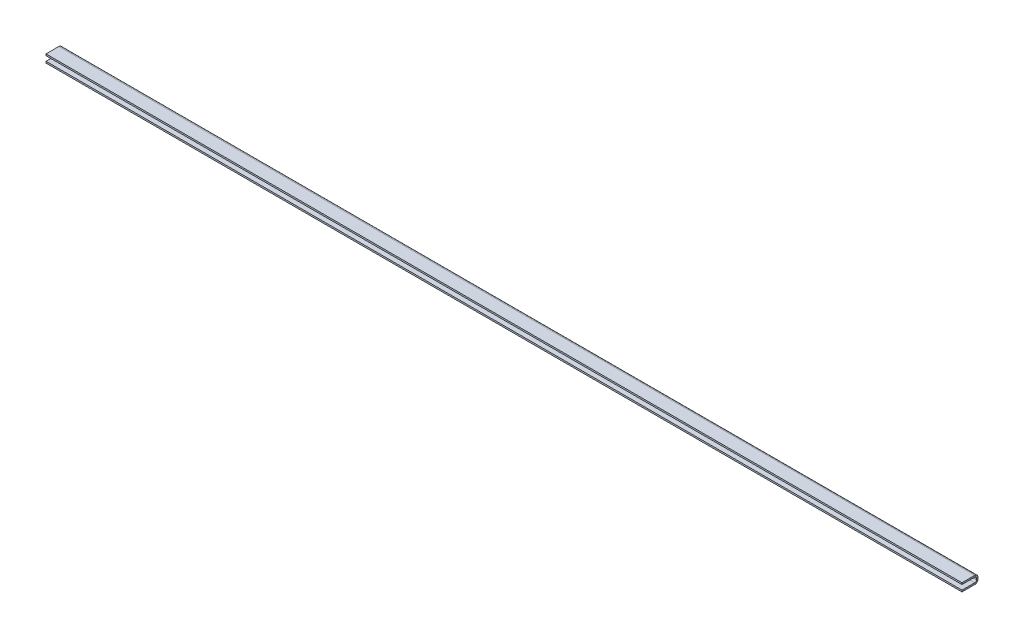
ISO-10303-21;
HEADER;
FILE_DESCRIPTION(('STEP AP214'),'2;1');
FILE_NAME('part.step','',(''),(''),'','','');
FILE_SCHEMA(('AUTOMOTIVE_DESIGN { 1 0 10303 214 1 1 1 1 }'));
ENDSEC;
DATA;
#1=APPLICATION_CONTEXT('core data for automotive mechanical design processes');
#2=APPLICATION_PROTOCOL_DEFINITION('international standard','automotive_design',2000,#1);
#3=PRODUCT_CONTEXT('',#1,'mechanical');
#4=PRODUCT('Part','Part','',(#3));
#5=PRODUCT_RELATED_PRODUCT_CATEGORY('part','',(#4));
#6=PRODUCT_DEFINITION_FORMATION('','',#4);
#7=PRODUCT_DEFINITION_CONTEXT('part definition',#1,'design');
#8=PRODUCT_DEFINITION('design','',#6,#7);
#9=PRODUCT_DEFINITION_SHAPE('','',#8);
#10=(LENGTH_UNIT() NAMED_UNIT(*) SI_UNIT(.MILLI.,.METRE.));
#11=(NAMED_UNIT(*) PLANE_ANGLE_UNIT() SI_UNIT($,.RADIAN.));
#12=(NAMED_UNIT(*) SI_UNIT($,.STERADIAN.) SOLID_ANGLE_UNIT());
#13=UNCERTAINTY_MEASURE_WITH_UNIT(LENGTH_MEASURE(1.E-05),#10,'distance_accuracy_value','');
#14=(GEOMETRIC_REPRESENTATION_CONTEXT(3) GLOBAL_UNCERTAINTY_ASSIGNED_CONTEXT((#13)) GLOBAL_UNIT_ASSIGNED_CONTEXT((#10,
#11,#12)) REPRESENTATION_CONTEXT('',''));
#15=CARTESIAN_POINT('',(0.,0.,0.));
#16=DIRECTION('',(0.,0.,1.));
#17=DIRECTION('',(1.,0.,0.));
#18=AXIS2_PLACEMENT_3D('',#15,#16,#17);
#19=CARTESIAN_POINT('',(0.,0.,-2.));
#20=DIRECTION('',(0.,0.,1.));
#21=DIRECTION('',(1.,0.,0.));
#22=AXIS2_PLACEMENT_3D('',#19,#20,#21);
#23=PLANE('',#22);
#24=DIRECTION('',(1.,0.,0.));
#25=VECTOR('',#24,1.);
#26=CARTESIAN_POINT('',(572.,-1.,-1.99999999999996));
#27=LINE('',#26,#25);
#28=CARTESIAN_POINT('',(572.,-1.,-1.99999999999996));
#29=VERTEX_POINT('',#28);
#30=CARTESIAN_POINT('',(-572.,-0.99999999999999,-2.));
#31=VERTEX_POINT('',#30);
#32=EDGE_CURVE('E211',#29,#31,#27,.F.);
#33=ORIENTED_EDGE('',*,*,#32,.T.);
#34=DIRECTION('',(0.,-1.,0.));
#35=VECTOR('',#34,1.);
#36=CARTESIAN_POINT('',(-572.,5.,-2.));
#37=LINE('',#36,#35);
#38=CARTESIAN_POINT('',(-572.,1.00000000000001,-2.));
#39=VERTEX_POINT('',#38);
#40=EDGE_CURVE('E13',#39,#31,#37,.T.);
#41=ORIENTED_EDGE('',*,*,#40,.F.);
#42=DIRECTION('',(-1.,0.,0.));
#43=VECTOR('',#42,1.);
#44=CARTESIAN_POINT('',(-572.,1.00000000000001,-2.));
#45=LINE('',#44,#43);
#46=CARTESIAN_POINT('',(572.,1.00000000000002,-2.));
#47=VERTEX_POINT('',#46);
#48=EDGE_CURVE('E264',#39,#47,#45,.F.);
#49=ORIENTED_EDGE('',*,*,#48,.T.);
#50=DIRECTION('',(0.,1.,0.));
#51=VECTOR('',#50,1.);
#52=CARTESIAN_POINT('',(572.,5.,-2.));
#53=LINE('',#52,#51);
#54=EDGE_CURVE('E87',#29,#47,#53,.T.);
#55=ORIENTED_EDGE('',*,*,#54,.F.);
#56=EDGE_LOOP('',(#33,#41,#49,#55));
#57=FACE_BOUND('',#56,.T.);
#58=ADVANCED_FACE('F78',(#57),#23,.F.);
#59=CARTESIAN_POINT('',(0.,0.,0.));
#60=DIRECTION('',(0.,0.,1.));
#61=DIRECTION('',(1.,0.,0.));
#62=AXIS2_PLACEMENT_3D('',#59,#60,#61);
#63=PLANE('',#62);
#64=DIRECTION('',(0.,-1.,0.));
#65=VECTOR('',#64,1.);
#66=CARTESIAN_POINT('',(-572.,5.,0.));
#67=LINE('',#66,#65);
#68=CARTESIAN_POINT('',(-572.,1.00000000000001,0.));
#69=VERTEX_POINT('',#68);
#70=CARTESIAN_POINT('',(-572.,-1.,0.));
#71=VERTEX_POINT('',#70);
#72=EDGE_CURVE('E82',#69,#71,#67,.T.);
#73=ORIENTED_EDGE('',*,*,#72,.T.);
#74=DIRECTION('',(1.,0.,0.));
#75=VECTOR('',#74,1.);
#76=CARTESIAN_POINT('',(572.,-1.,0.));
#77=LINE('',#76,#75);
#78=CARTESIAN_POINT('',(572.,-1.,0.));
#79=VERTEX_POINT('',#78);
#80=EDGE_CURVE('E223',#79,#71,#77,.F.);
#81=ORIENTED_EDGE('',*,*,#80,.F.);
#82=DIRECTION('',(0.,1.,0.));
#83=VECTOR('',#82,1.);
#84=CARTESIAN_POINT('',(572.,5.,0.));
#85=LINE('',#84,#83);
#86=CARTESIAN_POINT('',(572.,1.00000000000001,0.));
#87=VERTEX_POINT('',#86);
#88=EDGE_CURVE('E282',#79,#87,#85,.T.);
#89=ORIENTED_EDGE('',*,*,#88,.T.);
#90=DIRECTION('',(-1.,0.,0.));
#91=VECTOR('',#90,1.);
#92=CARTESIAN_POINT('',(-572.,1.00000000000001,0.));
#93=LINE('',#92,#91);
#94=EDGE_CURVE('E95',#69,#87,#93,.F.);
#95=ORIENTED_EDGE('',*,*,#94,.F.);
#96=EDGE_LOOP('',(#73,#81,#89,#95));
#97=FACE_BOUND('',#96,.T.);
#98=ADVANCED_FACE('F286',(#97),#63,.T.);
#99=CARTESIAN_POINT('',(572.,5.,-2.));
#100=DIRECTION('',(1.,0.,0.));
#101=DIRECTION('',(0.,0.,-1.));
#102=AXIS2_PLACEMENT_3D('',#99,#100,#101);
#103=PLANE('',#102);
#104=ORIENTED_EDGE('',*,*,#88,.F.);
#105=DIRECTION('',(0.,0.,-1.));
#106=VECTOR('',#105,1.);
#107=CARTESIAN_POINT('',(572.,-1.,0.));
#108=LINE('',#107,#106);
#109=EDGE_CURVE('E217',#79,#29,#108,.T.);
#110=ORIENTED_EDGE('',*,*,#109,.T.);
#111=ORIENTED_EDGE('',*,*,#54,.T.);
#112=DIRECTION('',(0.,0.,-1.));
#113=VECTOR('',#112,1.);
#114=CARTESIAN_POINT('',(572.,1.00000000000001,0.));
#115=LINE('',#114,#113);
#116=EDGE_CURVE('E279',#87,#47,#115,.T.);
#117=ORIENTED_EDGE('',*,*,#116,.F.);
#118=EDGE_LOOP('',(#104,#110,#111,#117));
#119=FACE_BOUND('',#118,.T.);
#120=ADVANCED_FACE('F80',(#119),#103,.T.);
#121=CARTESIAN_POINT('',(-572.,5.,-2.));
#122=DIRECTION('',(-1.,0.,0.));
#123=DIRECTION('',(0.,0.,1.));
#124=AXIS2_PLACEMENT_3D('',#121,#122,#123);
#125=PLANE('',#124);
#126=DIRECTION('',(0.,0.,-1.));
#127=VECTOR('',#126,1.);
#128=CARTESIAN_POINT('',(-572.,-1.,0.));
#129=LINE('',#128,#127);
#130=EDGE_CURVE('E229',#71,#31,#129,.T.);
#131=ORIENTED_EDGE('',*,*,#130,.F.);
#132=ORIENTED_EDGE('',*,*,#72,.F.);
#133=DIRECTION('',(0.,0.,-1.));
#134=VECTOR('',#133,1.);
#135=CARTESIAN_POINT('',(-572.,1.00000000000001,0.));
#136=LINE('',#135,#134);
#137=EDGE_CURVE('E270',#69,#39,#136,.T.);
#138=ORIENTED_EDGE('',*,*,#137,.T.);
#139=ORIENTED_EDGE('',*,*,#40,.T.);
#140=EDGE_LOOP('',(#131,#132,#138,#139));
#141=FACE_BOUND('',#140,.T.);
#142=ADVANCED_FACE('F358',(#141),#125,.T.);
#143=CARTESIAN_POINT('',(572.,1.00000000000001,2.));
#144=DIRECTION('',(1.,0.,0.));
#145=DIRECTION('',(0.,0.,-1.));
#146=AXIS2_PLACEMENT_3D('',#143,#144,#145);
#147=PLANE('',#146);
#148=DIRECTION('',(0.,-1.,0.));
#149=VECTOR('',#148,1.);
#150=CARTESIAN_POINT('',(572.,5.00000000000001,1.99999999999999));
#151=LINE('',#150,#149);
#152=CARTESIAN_POINT('',(572.,3.00000000000001,1.99999999999999));
#153=VERTEX_POINT('',#152);
#154=CARTESIAN_POINT('',(572.,5.00000000000001,1.99999999999999));
#155=VERTEX_POINT('',#154);
#156=EDGE_CURVE('E232',#153,#155,#151,.F.);
#157=ORIENTED_EDGE('',*,*,#156,.F.);
#158=CARTESIAN_POINT('',(572.,1.00000000000001,2.));
#159=DIRECTION('',(-1.,0.,0.));
#160=DIRECTION('',(0.,0.,1.));
#161=AXIS2_PLACEMENT_3D('',#158,#159,#160);
#162=CIRCLE('',#161,2.);
#163=EDGE_CURVE('E273',#87,#153,#162,.F.);
#164=ORIENTED_EDGE('',*,*,#163,.F.);
#165=ORIENTED_EDGE('',*,*,#116,.T.);
#166=CARTESIAN_POINT('',(572.,1.00000000000001,2.));
#167=DIRECTION('',(-1.,0.,0.));
#168=DIRECTION('',(0.,0.,1.));
#169=AXIS2_PLACEMENT_3D('',#166,#167,#168);
#170=CIRCLE('',#169,4.);
#171=EDGE_CURVE('E266',#47,#155,#170,.F.);
#172=ORIENTED_EDGE('',*,*,#171,.T.);
#173=EDGE_LOOP('',(#157,#164,#165,#172));
#174=FACE_BOUND('',#173,.T.);
#175=ADVANCED_FACE('F317',(#174),#147,.T.);
#176=CARTESIAN_POINT('',(-572.,1.00000000000001,2.));
#177=DIRECTION('',(1.,0.,0.));
#178=DIRECTION('',(0.,0.,-1.));
#179=AXIS2_PLACEMENT_3D('',#176,#177,#178);
#180=PLANE('',#179);
#181=CARTESIAN_POINT('',(-572.,1.00000000000001,2.));
#182=DIRECTION('',(-1.,0.,0.));
#183=DIRECTION('',(0.,0.,1.));
#184=AXIS2_PLACEMENT_3D('',#181,#182,#183);
#185=CIRCLE('',#184,2.);
#186=CARTESIAN_POINT('',(-572.,3.00000000000001,1.99999999999999));
#187=VERTEX_POINT('',#186);
#188=EDGE_CURVE('E237',#187,#69,#185,.T.);
#189=ORIENTED_EDGE('',*,*,#188,.F.);
#190=DIRECTION('',(0.,-1.,0.));
#191=VECTOR('',#190,1.);
#192=CARTESIAN_POINT('',(-572.,3.00000000000001,1.99999999999999));
#193=LINE('',#192,#191);
#194=CARTESIAN_POINT('',(-572.,5.00000000000001,1.99999999999999));
#195=VERTEX_POINT('',#194);
#196=EDGE_CURVE('E257',#187,#195,#193,.F.);
#197=ORIENTED_EDGE('',*,*,#196,.T.);
#198=CARTESIAN_POINT('',(-572.,1.00000000000001,2.));
#199=DIRECTION('',(-1.,0.,0.));
#200=DIRECTION('',(0.,0.,1.));
#201=AXIS2_PLACEMENT_3D('',#198,#199,#200);
#202=CIRCLE('',#201,4.);
#203=EDGE_CURVE('E267',#195,#39,#202,.T.);
#204=ORIENTED_EDGE('',*,*,#203,.T.);
#205=ORIENTED_EDGE('',*,*,#137,.F.);
#206=EDGE_LOOP('',(#189,#197,#204,#205));
#207=FACE_BOUND('',#206,.T.);
#208=ADVANCED_FACE('F337',(#207),#180,.F.);
#209=CARTESIAN_POINT('',(-572.,1.00000000000001,2.));
#210=DIRECTION('',(-1.,0.,0.));
#211=DIRECTION('',(0.,1.,0.));
#212=AXIS2_PLACEMENT_3D('',#209,#210,#211);
#213=CYLINDRICAL_SURFACE('',#212,4.);
#214=ORIENTED_EDGE('',*,*,#48,.F.);
#215=ORIENTED_EDGE('',*,*,#203,.F.);
#216=DIRECTION('',(-1.,0.,0.));
#217=VECTOR('',#216,1.);
#218=CARTESIAN_POINT('',(572.,5.00000000000001,1.99999999999999));
#219=LINE('',#218,#217);
#220=EDGE_CURVE('E255',#195,#155,#219,.F.);
#221=ORIENTED_EDGE('',*,*,#220,.T.);
#222=ORIENTED_EDGE('',*,*,#171,.F.);
#223=EDGE_LOOP('',(#214,#215,#221,#222));
#224=FACE_BOUND('',#223,.T.);
#225=ADVANCED_FACE('F366',(#224),#213,.T.);
#226=CARTESIAN_POINT('',(-572.,1.00000000000001,2.));
#227=DIRECTION('',(-1.,0.,0.));
#228=DIRECTION('',(0.,1.,0.));
#229=AXIS2_PLACEMENT_3D('',#226,#227,#228);
#230=CYLINDRICAL_SURFACE('',#229,2.);
#231=ORIENTED_EDGE('',*,*,#94,.T.);
#232=ORIENTED_EDGE('',*,*,#163,.T.);
#233=DIRECTION('',(-1.,0.,0.));
#234=VECTOR('',#233,1.);
#235=CARTESIAN_POINT('',(572.,3.00000000000001,1.99999999999999));
#236=LINE('',#235,#234);
#237=EDGE_CURVE('E260',#153,#187,#236,.T.);
#238=ORIENTED_EDGE('',*,*,#237,.T.);
#239=ORIENTED_EDGE('',*,*,#188,.T.);
#240=EDGE_LOOP('',(#231,#232,#238,#239));
#241=FACE_BOUND('',#240,.T.);
#242=ADVANCED_FACE('F314',(#241),#230,.F.);
#243=CARTESIAN_POINT('',(572.,5.,0.));
#244=DIRECTION('',(-1.,0.,0.));
#245=DIRECTION('',(0.,0.,1.));
#246=AXIS2_PLACEMENT_3D('',#243,#244,#245);
#247=PLANE('',#246);
#248=ORIENTED_EDGE('',*,*,#156,.T.);
#249=DIRECTION('',(0.,0.,-1.));
#250=VECTOR('',#249,1.);
#251=CARTESIAN_POINT('',(572.,5.,2.11439221387489E-11));
#252=LINE('',#251,#250);
#253=CARTESIAN_POINT('',(572.,5.00000000000006,18.));
#254=VERTEX_POINT('',#253);
#255=EDGE_CURVE('E245',#254,#155,#252,.T.);
#256=ORIENTED_EDGE('',*,*,#255,.F.);
#257=DIRECTION('',(0.,-1.,0.));
#258=VECTOR('',#257,1.);
#259=CARTESIAN_POINT('',(572.,5.00000000000006,18.));
#260=LINE('',#259,#258);
#261=CARTESIAN_POINT('',(572.,3.00000000000007,18.));
#262=VERTEX_POINT('',#261);
#263=EDGE_CURVE('E238',#254,#262,#260,.T.);
#264=ORIENTED_EDGE('',*,*,#263,.T.);
#265=DIRECTION('',(0.,0.,1.));
#266=VECTOR('',#265,1.);
#267=CARTESIAN_POINT('',(572.,3.,0.));
#268=LINE('',#267,#266);
#269=EDGE_CURVE('E252',#262,#153,#268,.F.);
#270=ORIENTED_EDGE('',*,*,#269,.T.);
#271=EDGE_LOOP('',(#248,#256,#264,#270));
#272=FACE_BOUND('',#271,.T.);
#273=ADVANCED_FACE('F320',(#272),#247,.F.);
#274=CARTESIAN_POINT('',(-572.,5.00000000000006,18.));
#275=DIRECTION('',(1.,0.,0.));
#276=DIRECTION('',(0.,0.,-1.));
#277=AXIS2_PLACEMENT_3D('',#274,#275,#276);
#278=PLANE('',#277);
#279=ORIENTED_EDGE('',*,*,#196,.F.);
#280=DIRECTION('',(0.,0.,-1.));
#281=VECTOR('',#280,1.);
#282=CARTESIAN_POINT('',(-572.,3.00000000000007,18.));
#283=LINE('',#282,#281);
#284=CARTESIAN_POINT('',(-572.,3.00000000000007,18.));
#285=VERTEX_POINT('',#284);
#286=EDGE_CURVE('E250',#187,#285,#283,.F.);
#287=ORIENTED_EDGE('',*,*,#286,.T.);
#288=DIRECTION('',(0.,-1.,0.));
#289=VECTOR('',#288,1.);
#290=CARTESIAN_POINT('',(-572.,5.00000000000006,18.));
#291=LINE('',#290,#289);
#292=CARTESIAN_POINT('',(-572.,5.00000000000006,18.));
#293=VERTEX_POINT('',#292);
#294=EDGE_CURVE('E234',#293,#285,#291,.T.);
#295=ORIENTED_EDGE('',*,*,#294,.F.);
#296=DIRECTION('',(0.,0.,1.));
#297=VECTOR('',#296,1.);
#298=CARTESIAN_POINT('',(-572.,5.,-1.76645404775927E-11));
#299=LINE('',#298,#297);
#300=EDGE_CURVE('E243',#195,#293,#299,.T.);
#301=ORIENTED_EDGE('',*,*,#300,.F.);
#302=EDGE_LOOP('',(#279,#287,#295,#301));
#303=FACE_BOUND('',#302,.T.);
#304=ADVANCED_FACE('F339',(#303),#278,.F.);
#305=CARTESIAN_POINT('',(0.,5.,0.));
#306=DIRECTION('',(0.,-1.,0.));
#307=DIRECTION('',(0.,0.,-1.));
#308=AXIS2_PLACEMENT_3D('',#305,#306,#307);
#309=PLANE('',#308);
#310=ORIENTED_EDGE('',*,*,#220,.F.);
#311=ORIENTED_EDGE('',*,*,#300,.T.);
#312=DIRECTION('',(1.,0.,0.));
#313=VECTOR('',#312,1.);
#314=CARTESIAN_POINT('',(0.,5.00000000000006,18.));
#315=LINE('',#314,#313);
#316=EDGE_CURVE('E241',#293,#254,#315,.T.);
#317=ORIENTED_EDGE('',*,*,#316,.T.);
#318=ORIENTED_EDGE('',*,*,#255,.T.);
#319=EDGE_LOOP('',(#310,#311,#317,#318));
#320=FACE_BOUND('',#319,.T.);
#321=ADVANCED_FACE('F324',(#320),#309,.F.);
#322=CARTESIAN_POINT('',(0.,3.,0.));
#323=DIRECTION('',(0.,-1.,0.));
#324=DIRECTION('',(0.,0.,-1.));
#325=AXIS2_PLACEMENT_3D('',#322,#323,#324);
#326=PLANE('',#325);
#327=ORIENTED_EDGE('',*,*,#286,.F.);
#328=ORIENTED_EDGE('',*,*,#237,.F.);
#329=ORIENTED_EDGE('',*,*,#269,.F.);
#330=DIRECTION('',(-1.,0.,0.));
#331=VECTOR('',#330,1.);
#332=CARTESIAN_POINT('',(572.,3.00000000000007,18.));
#333=LINE('',#332,#331);
#334=EDGE_CURVE('E248',#285,#262,#333,.F.);
#335=ORIENTED_EDGE('',*,*,#334,.F.);
#336=EDGE_LOOP('',(#327,#328,#329,#335));
#337=FACE_BOUND('',#336,.T.);
#338=ADVANCED_FACE('F334',(#337),#326,.T.);
#339=CARTESIAN_POINT('',(572.,5.00000000000006,18.));
#340=DIRECTION('',(0.,0.,-1.));
#341=DIRECTION('',(0.,1.,0.));
#342=AXIS2_PLACEMENT_3D('',#339,#340,#341);
#343=PLANE('',#342);
#344=ORIENTED_EDGE('',*,*,#334,.T.);
#345=ORIENTED_EDGE('',*,*,#263,.F.);
#346=ORIENTED_EDGE('',*,*,#316,.F.);
#347=ORIENTED_EDGE('',*,*,#294,.T.);
#348=EDGE_LOOP('',(#344,#345,#346,#347));
#349=FACE_BOUND('',#348,.T.);
#350=ADVANCED_FACE('F330',(#349),#343,.F.);
#351=CARTESIAN_POINT('',(-572.,-1.,2.00000000000004));
#352=DIRECTION('',(-1.,0.,0.));
#353=DIRECTION('',(0.,0.,1.));
#354=AXIS2_PLACEMENT_3D('',#351,#352,#353);
#355=PLANE('',#354);
#356=DIRECTION('',(0.,1.,0.));
#357=VECTOR('',#356,1.);
#358=CARTESIAN_POINT('',(-572.,-5.,1.99999999999999));
#359=LINE('',#358,#357);
#360=CARTESIAN_POINT('',(-572.,-3.,2.00000000000004));
#361=VERTEX_POINT('',#360);
#362=CARTESIAN_POINT('',(-572.,-5.,2.00000000000003));
#363=VERTEX_POINT('',#362);
#364=EDGE_CURVE('E194',#361,#363,#359,.F.);
#365=ORIENTED_EDGE('',*,*,#364,.F.);
#366=CARTESIAN_POINT('',(-572.,-1.,2.00000000000004));
#367=DIRECTION('',(1.,0.,0.));
#368=DIRECTION('',(0.,0.,-1.));
#369=AXIS2_PLACEMENT_3D('',#366,#367,#368);
#370=CIRCLE('',#369,2.);
#371=EDGE_CURVE('E220',#71,#361,#370,.F.);
#372=ORIENTED_EDGE('',*,*,#371,.F.);
#373=ORIENTED_EDGE('',*,*,#130,.T.);
#374=CARTESIAN_POINT('',(-572.,-1.,2.00000000000004));
#375=DIRECTION('',(1.,0.,0.));
#376=DIRECTION('',(0.,0.,-1.));
#377=AXIS2_PLACEMENT_3D('',#374,#375,#376);
#378=CIRCLE('',#377,4.);
#379=EDGE_CURVE('E213',#31,#363,#378,.F.);
#380=ORIENTED_EDGE('',*,*,#379,.T.);
#381=EDGE_LOOP('',(#365,#372,#373,#380));
#382=FACE_BOUND('',#381,.T.);
#383=ADVANCED_FACE('F295',(#382),#355,.T.);
#384=CARTESIAN_POINT('',(572.,-1.,2.00000000000004));
#385=DIRECTION('',(-1.,0.,0.));
#386=DIRECTION('',(0.,0.,1.));
#387=AXIS2_PLACEMENT_3D('',#384,#385,#386);
#388=PLANE('',#387);
#389=CARTESIAN_POINT('',(572.,-1.,2.00000000000004));
#390=DIRECTION('',(1.,0.,0.));
#391=DIRECTION('',(0.,0.,-1.));
#392=AXIS2_PLACEMENT_3D('',#389,#390,#391);
#393=CIRCLE('',#392,2.);
#394=CARTESIAN_POINT('',(572.,-3.,2.00000000000004));
#395=VERTEX_POINT('',#394);
#396=EDGE_CURVE('E226',#395,#79,#393,.T.);
#397=ORIENTED_EDGE('',*,*,#396,.F.);
#398=DIRECTION('',(0.,1.,0.));
#399=VECTOR('',#398,1.);
#400=CARTESIAN_POINT('',(572.,-3.,2.00000000000008));
#401=LINE('',#400,#399);
#402=CARTESIAN_POINT('',(572.,-5.,2.00000000000007));
#403=VERTEX_POINT('',#402);
#404=EDGE_CURVE('E205',#395,#403,#401,.F.);
#405=ORIENTED_EDGE('',*,*,#404,.T.);
#406=CARTESIAN_POINT('',(572.,-1.,2.00000000000004));
#407=DIRECTION('',(1.,0.,0.));
#408=DIRECTION('',(0.,0.,-1.));
#409=AXIS2_PLACEMENT_3D('',#406,#407,#408);
#410=CIRCLE('',#409,4.);
#411=EDGE_CURVE('E214',#403,#29,#410,.T.);
#412=ORIENTED_EDGE('',*,*,#411,.T.);
#413=ORIENTED_EDGE('',*,*,#109,.F.);
#414=EDGE_LOOP('',(#397,#405,#412,#413));
#415=FACE_BOUND('',#414,.T.);
#416=ADVANCED_FACE('F309',(#415),#388,.F.);
#417=CARTESIAN_POINT('',(572.,-1.,2.00000000000004));
#418=DIRECTION('',(1.,0.,0.));
#419=DIRECTION('',(0.,-1.,0.));
#420=AXIS2_PLACEMENT_3D('',#417,#418,#419);
#421=CYLINDRICAL_SURFACE('',#420,4.);
#422=ORIENTED_EDGE('',*,*,#32,.F.);
#423=ORIENTED_EDGE('',*,*,#411,.F.);
#424=DIRECTION('',(1.,0.,0.));
#425=VECTOR('',#424,1.);
#426=CARTESIAN_POINT('',(-572.,-5.,1.99999999999999));
#427=LINE('',#426,#425);
#428=EDGE_CURVE('E203',#403,#363,#427,.F.);
#429=ORIENTED_EDGE('',*,*,#428,.T.);
#430=ORIENTED_EDGE('',*,*,#379,.F.);
#431=EDGE_LOOP('',(#422,#423,#429,#430));
#432=FACE_BOUND('',#431,.T.);
#433=ADVANCED_FACE('F299',(#432),#421,.T.);
#434=CARTESIAN_POINT('',(572.,-1.,2.00000000000004));
#435=DIRECTION('',(1.,0.,0.));
#436=DIRECTION('',(0.,-1.,0.));
#437=AXIS2_PLACEMENT_3D('',#434,#435,#436);
#438=CYLINDRICAL_SURFACE('',#437,2.);
#439=ORIENTED_EDGE('',*,*,#80,.T.);
#440=ORIENTED_EDGE('',*,*,#371,.T.);
#441=DIRECTION('',(1.,0.,0.));
#442=VECTOR('',#441,1.);
#443=CARTESIAN_POINT('',(-572.,-3.,1.99999999999999));
#444=LINE('',#443,#442);
#445=EDGE_CURVE('E208',#361,#395,#444,.T.);
#446=ORIENTED_EDGE('',*,*,#445,.T.);
#447=ORIENTED_EDGE('',*,*,#396,.T.);
#448=EDGE_LOOP('',(#439,#440,#446,#447));
#449=FACE_BOUND('',#448,.T.);
#450=ADVANCED_FACE('F291',(#449),#438,.F.);
#451=CARTESIAN_POINT('',(-572.,-5.,0.));
#452=DIRECTION('',(1.,0.,0.));
#453=DIRECTION('',(0.,0.,-1.));
#454=AXIS2_PLACEMENT_3D('',#451,#452,#453);
#455=PLANE('',#454);
#456=ORIENTED_EDGE('',*,*,#364,.T.);
#457=DIRECTION('',(0.,0.,-1.));
#458=VECTOR('',#457,1.);
#459=CARTESIAN_POINT('',(-572.,-5.,-1.76645404775927E-11));
#460=LINE('',#459,#458);
#461=CARTESIAN_POINT('',(-572.,-5.00000000000006,18.));
#462=VERTEX_POINT('',#461);
#463=EDGE_CURVE('E175',#462,#363,#460,.T.);
#464=ORIENTED_EDGE('',*,*,#463,.F.);
#465=DIRECTION('',(0.,1.,0.));
#466=VECTOR('',#465,1.);
#467=CARTESIAN_POINT('',(-572.,-5.00000000000006,18.));
#468=LINE('',#467,#466);
#469=CARTESIAN_POINT('',(-572.,-3.00000000000006,18.));
#470=VERTEX_POINT('',#469);
#471=EDGE_CURVE('E181',#462,#470,#468,.T.);
#472=ORIENTED_EDGE('',*,*,#471,.T.);
#473=DIRECTION('',(0.,0.,1.));
#474=VECTOR('',#473,1.);
#475=CARTESIAN_POINT('',(-572.,-3.,0.));
#476=LINE('',#475,#474);
#477=EDGE_CURVE('E201',#470,#361,#476,.F.);
#478=ORIENTED_EDGE('',*,*,#477,.T.);
#479=EDGE_LOOP('',(#456,#464,#472,#478));
#480=FACE_BOUND('',#479,.T.);
#481=ADVANCED_FACE('F193',(#480),#455,.F.);
#482=CARTESIAN_POINT('',(572.,-5.00000000000006,18.));
#483=DIRECTION('',(-1.,0.,0.));
#484=DIRECTION('',(0.,0.,1.));
#485=AXIS2_PLACEMENT_3D('',#482,#483,#484);
#486=PLANE('',#485);
#487=ORIENTED_EDGE('',*,*,#404,.F.);
#488=DIRECTION('',(0.,0.,-1.));
#489=VECTOR('',#488,1.);
#490=CARTESIAN_POINT('',(572.,-3.00000000000006,18.));
#491=LINE('',#490,#489);
#492=CARTESIAN_POINT('',(572.,-3.00000000000006,18.));
#493=VERTEX_POINT('',#492);
#494=EDGE_CURVE('E197',#395,#493,#491,.F.);
#495=ORIENTED_EDGE('',*,*,#494,.T.);
#496=DIRECTION('',(0.,1.,0.));
#497=VECTOR('',#496,1.);
#498=CARTESIAN_POINT('',(572.,-5.00000000000006,18.));
#499=LINE('',#498,#497);
#500=CARTESIAN_POINT('',(572.,-5.00000000000006,18.));
#501=VERTEX_POINT('',#500);
#502=EDGE_CURVE('E190',#501,#493,#499,.T.);
#503=ORIENTED_EDGE('',*,*,#502,.F.);
#504=DIRECTION('',(0.,0.,1.));
#505=VECTOR('',#504,1.);
#506=CARTESIAN_POINT('',(572.,-5.,2.11439221387489E-11));
#507=LINE('',#506,#505);
#508=EDGE_CURVE('E177',#403,#501,#507,.T.);
#509=ORIENTED_EDGE('',*,*,#508,.F.);
#510=EDGE_LOOP('',(#487,#495,#503,#509));
#511=FACE_BOUND('',#510,.T.);
#512=ADVANCED_FACE('F302',(#511),#486,.F.);
#513=CARTESIAN_POINT('',(0.,-5.,0.));
#514=DIRECTION('',(0.,1.,0.));
#515=DIRECTION('',(0.,0.,1.));
#516=AXIS2_PLACEMENT_3D('',#513,#514,#515);
#517=PLANE('',#516);
#518=ORIENTED_EDGE('',*,*,#428,.F.);
#519=ORIENTED_EDGE('',*,*,#508,.T.);
#520=DIRECTION('',(-1.,0.,0.));
#521=VECTOR('',#520,1.);
#522=CARTESIAN_POINT('',(0.,-5.00000000000006,18.));
#523=LINE('',#522,#521);
#524=EDGE_CURVE('E170',#501,#462,#523,.T.);
#525=ORIENTED_EDGE('',*,*,#524,.T.);
#526=ORIENTED_EDGE('',*,*,#463,.T.);
#527=EDGE_LOOP('',(#518,#519,#525,#526));
#528=FACE_BOUND('',#527,.T.);
#529=ADVANCED_FACE('F173',(#528),#517,.F.);
#530=CARTESIAN_POINT('',(0.,-3.,0.));
#531=DIRECTION('',(0.,1.,0.));
#532=DIRECTION('',(0.,0.,1.));
#533=AXIS2_PLACEMENT_3D('',#530,#531,#532);
#534=PLANE('',#533);
#535=ORIENTED_EDGE('',*,*,#494,.F.);
#536=ORIENTED_EDGE('',*,*,#445,.F.);
#537=ORIENTED_EDGE('',*,*,#477,.F.);
#538=DIRECTION('',(1.,0.,0.));
#539=VECTOR('',#538,1.);
#540=CARTESIAN_POINT('',(-572.,-3.00000000000006,18.));
#541=LINE('',#540,#539);
#542=EDGE_CURVE('E186',#493,#470,#541,.F.);
#543=ORIENTED_EDGE('',*,*,#542,.F.);
#544=EDGE_LOOP('',(#535,#536,#537,#543));
#545=FACE_BOUND('',#544,.T.);
#546=ADVANCED_FACE('F306',(#545),#534,.T.);
#547=CARTESIAN_POINT('',(-572.,-5.00000000000006,18.));
#548=DIRECTION('',(0.,0.,-1.));
#549=DIRECTION('',(0.,1.,0.));
#550=AXIS2_PLACEMENT_3D('',#547,#548,#549);
#551=PLANE('',#550);
#552=ORIENTED_EDGE('',*,*,#542,.T.);
#553=ORIENTED_EDGE('',*,*,#471,.F.);
#554=ORIENTED_EDGE('',*,*,#524,.F.);
#555=ORIENTED_EDGE('',*,*,#502,.T.);
#556=EDGE_LOOP('',(#552,#553,#554,#555));
#557=FACE_BOUND('',#556,.T.);
#558=ADVANCED_FACE('F184',(#557),#551,.F.);
#559=CLOSED_SHELL('',(#58,#98,#120,#142,#175,#208,#225,#242,#273,#304,#321,#338,#350,#383,#416,
#433,#450,#481,#512,#529,#546,#558));
#560=MANIFOLD_SOLID_BREP('B2',#559);
#561=ADVANCED_BREP_SHAPE_REPRESENTATION('',(#18,#560),#14);
#562=SHAPE_DEFINITION_REPRESENTATION(#9,#561);
ENDSEC;
END-ISO-10303-21;
